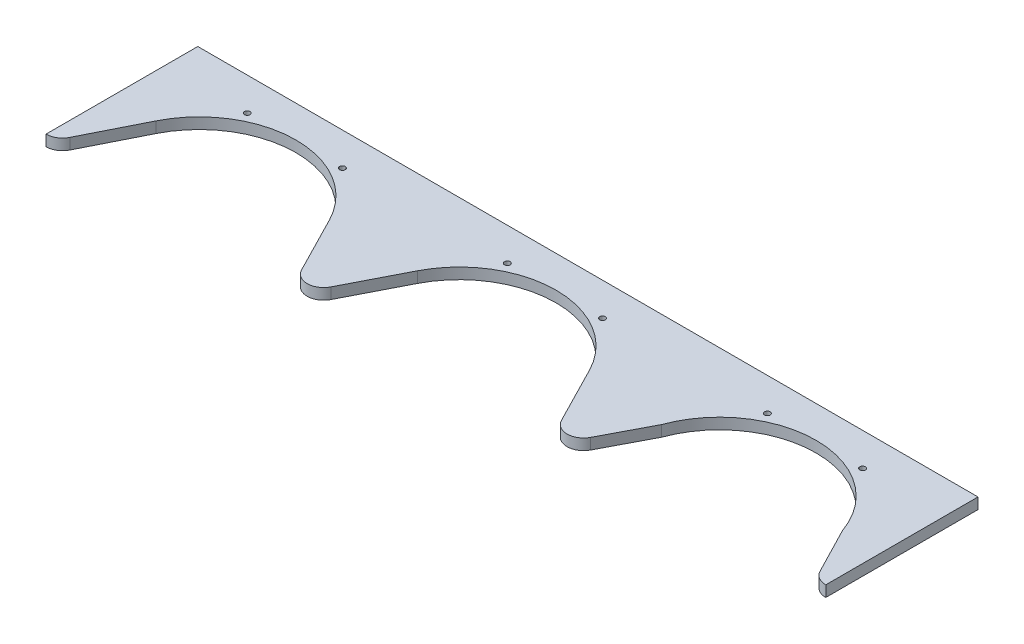
ISO-10303-21;
HEADER;
FILE_DESCRIPTION(('STEP AP214'),'2;1');
FILE_NAME('part.step','',(''),(''),'','','');
FILE_SCHEMA(('AUTOMOTIVE_DESIGN { 1 0 10303 214 1 1 1 1 }'));
ENDSEC;
DATA;
#1=APPLICATION_CONTEXT('core data for automotive mechanical design processes');
#2=APPLICATION_PROTOCOL_DEFINITION('international standard','automotive_design',2000,#1);
#3=PRODUCT_CONTEXT('',#1,'mechanical');
#4=PRODUCT('Part','Part','',(#3));
#5=PRODUCT_RELATED_PRODUCT_CATEGORY('part','',(#4));
#6=PRODUCT_DEFINITION_FORMATION('','',#4);
#7=PRODUCT_DEFINITION_CONTEXT('part definition',#1,'design');
#8=PRODUCT_DEFINITION('design','',#6,#7);
#9=PRODUCT_DEFINITION_SHAPE('','',#8);
#10=(LENGTH_UNIT() NAMED_UNIT(*) SI_UNIT(.MILLI.,.METRE.));
#11=(NAMED_UNIT(*) PLANE_ANGLE_UNIT() SI_UNIT($,.RADIAN.));
#12=(NAMED_UNIT(*) SI_UNIT($,.STERADIAN.) SOLID_ANGLE_UNIT());
#13=UNCERTAINTY_MEASURE_WITH_UNIT(LENGTH_MEASURE(1.E-05),#10,'distance_accuracy_value','');
#14=(GEOMETRIC_REPRESENTATION_CONTEXT(3) GLOBAL_UNCERTAINTY_ASSIGNED_CONTEXT((#13)) GLOBAL_UNIT_ASSIGNED_CONTEXT((#10,
#11,#12)) REPRESENTATION_CONTEXT('',''));
#15=CARTESIAN_POINT('',(0.,0.,0.));
#16=DIRECTION('',(0.,0.,1.));
#17=DIRECTION('',(1.,0.,0.));
#18=AXIS2_PLACEMENT_3D('',#15,#16,#17);
#19=CARTESIAN_POINT('',(-280.073238202378,-6.35,2.62205042113195));
#20=DIRECTION('',(-1.,0.,0.));
#21=DIRECTION('',(0.,0.,1.));
#22=AXIS2_PLACEMENT_3D('',#19,#20,#21);
#23=PLANE('',#22);
#24=DIRECTION('',(0.,0.,1.));
#25=VECTOR('',#24,1.);
#26=CARTESIAN_POINT('',(-280.073238202378,0.,2.62205042113195));
#27=LINE('',#26,#25);
#28=CARTESIAN_POINT('',(-280.073238202378,0.,-62.6015765640897));
#29=VERTEX_POINT('',#28);
#30=CARTESIAN_POINT('',(-280.073238202378,0.,25.1077984359102));
#31=VERTEX_POINT('',#30);
#32=EDGE_CURVE('E225',#29,#31,#27,.T.);
#33=ORIENTED_EDGE('',*,*,#32,.F.);
#34=DIRECTION('',(0.,1.,0.));
#35=VECTOR('',#34,1.);
#36=CARTESIAN_POINT('',(-280.073238202378,-6.35,-62.6015765640897));
#37=LINE('',#36,#35);
#38=CARTESIAN_POINT('',(-280.073238202378,-6.35,-62.6015765640897));
#39=VERTEX_POINT('',#38);
#40=EDGE_CURVE('E171',#39,#29,#37,.T.);
#41=ORIENTED_EDGE('',*,*,#40,.F.);
#42=DIRECTION('',(0.,0.,1.));
#43=VECTOR('',#42,1.);
#44=CARTESIAN_POINT('',(-280.073238202378,-6.35,2.62205042113195));
#45=LINE('',#44,#43);
#46=CARTESIAN_POINT('',(-280.073238202378,-6.35,25.1077984359102));
#47=VERTEX_POINT('',#46);
#48=EDGE_CURVE('E166',#39,#47,#45,.T.);
#49=ORIENTED_EDGE('',*,*,#48,.T.);
#50=DIRECTION('',(0.,1.,0.));
#51=VECTOR('',#50,1.);
#52=CARTESIAN_POINT('',(-280.073238202378,-6.35,25.1077984359102));
#53=LINE('',#52,#51);
#54=EDGE_CURVE('E148',#47,#31,#53,.T.);
#55=ORIENTED_EDGE('',*,*,#54,.T.);
#56=EDGE_LOOP('',(#33,#41,#49,#55));
#57=FACE_BOUND('',#56,.T.);
#58=ADVANCED_FACE('F35',(#57),#23,.T.);
#59=CARTESIAN_POINT('',(-427.444683767428,-6.35,-62.6015765640897));
#60=DIRECTION('',(0.,0.,1.));
#61=DIRECTION('',(1.,0.,0.));
#62=AXIS2_PLACEMENT_3D('',#59,#60,#61);
#63=PLANE('',#62);
#64=DIRECTION('',(1.,0.,0.));
#65=VECTOR('',#64,1.);
#66=CARTESIAN_POINT('',(-427.444683767428,0.,-62.6015765640897));
#67=LINE('',#66,#65);
#68=CARTESIAN_POINT('',(170.776761797622,0.,-62.6015765640897));
#69=VERTEX_POINT('',#68);
#70=EDGE_CURVE('E259',#29,#69,#67,.T.);
#71=ORIENTED_EDGE('',*,*,#70,.T.);
#72=DIRECTION('',(0.,1.,0.));
#73=VECTOR('',#72,1.);
#74=CARTESIAN_POINT('',(170.776761797622,-6.35,-62.6015765640897));
#75=LINE('',#74,#73);
#76=CARTESIAN_POINT('',(170.776761797622,-6.35,-62.6015765640897));
#77=VERTEX_POINT('',#76);
#78=EDGE_CURVE('E276',#77,#69,#75,.T.);
#79=ORIENTED_EDGE('',*,*,#78,.F.);
#80=DIRECTION('',(1.,0.,0.));
#81=VECTOR('',#80,1.);
#82=CARTESIAN_POINT('',(-427.444683767428,-6.35,-62.6015765640897));
#83=LINE('',#82,#81);
#84=EDGE_CURVE('E206',#39,#77,#83,.T.);
#85=ORIENTED_EDGE('',*,*,#84,.F.);
#86=ORIENTED_EDGE('',*,*,#40,.T.);
#87=EDGE_LOOP('',(#71,#79,#85,#86));
#88=FACE_BOUND('',#87,.T.);
#89=ADVANCED_FACE('F328',(#88),#63,.F.);
#90=CARTESIAN_POINT('',(170.776761797622,-6.35,2.62205042113195));
#91=DIRECTION('',(-1.,0.,0.));
#92=DIRECTION('',(0.,0.,1.));
#93=AXIS2_PLACEMENT_3D('',#90,#91,#92);
#94=PLANE('',#93);
#95=DIRECTION('',(0.,0.,1.));
#96=VECTOR('',#95,1.);
#97=CARTESIAN_POINT('',(170.776761797622,0.,2.62205042113195));
#98=LINE('',#97,#96);
#99=CARTESIAN_POINT('',(170.776761797622,0.,25.3727717752158));
#100=VERTEX_POINT('',#99);
#101=EDGE_CURVE('E256',#69,#100,#98,.T.);
#102=ORIENTED_EDGE('',*,*,#101,.T.);
#103=DIRECTION('',(0.,1.,0.));
#104=VECTOR('',#103,1.);
#105=CARTESIAN_POINT('',(170.776761797622,-6.35,25.3727717752158));
#106=LINE('',#105,#104);
#107=CARTESIAN_POINT('',(170.776761797622,-6.35,25.3727717752158));
#108=VERTEX_POINT('',#107);
#109=EDGE_CURVE('E279',#108,#100,#106,.T.);
#110=ORIENTED_EDGE('',*,*,#109,.F.);
#111=DIRECTION('',(0.,0.,1.));
#112=VECTOR('',#111,1.);
#113=CARTESIAN_POINT('',(170.776761797622,-6.35,2.62205042113195));
#114=LINE('',#113,#112);
#115=EDGE_CURVE('E204',#77,#108,#114,.T.);
#116=ORIENTED_EDGE('',*,*,#115,.F.);
#117=ORIENTED_EDGE('',*,*,#78,.T.);
#118=EDGE_LOOP('',(#102,#110,#116,#117));
#119=FACE_BOUND('',#118,.T.);
#120=ADVANCED_FACE('F333',(#119),#94,.F.);
#121=CARTESIAN_POINT('',(170.776761797622,-6.35,15.8477717752158));
#122=DIRECTION('',(0.,1.,0.));
#123=DIRECTION('',(0.,0.,1.));
#124=AXIS2_PLACEMENT_3D('',#121,#122,#123);
#125=CYLINDRICAL_SURFACE('',#124,9.525);
#126=CARTESIAN_POINT('',(170.776761797622,0.,15.8477717752158));
#127=DIRECTION('',(0.,1.,0.));
#128=DIRECTION('',(0.,0.,1.));
#129=AXIS2_PLACEMENT_3D('',#126,#127,#128);
#130=CIRCLE('',#129,9.525);
#131=CARTESIAN_POINT('',(162.31442899308,0.,20.219790588668));
#132=VERTEX_POINT('',#131);
#133=EDGE_CURVE('E253',#132,#100,#130,.T.);
#134=ORIENTED_EDGE('',*,*,#133,.F.);
#135=DIRECTION('',(0.,1.,0.));
#136=VECTOR('',#135,1.);
#137=CARTESIAN_POINT('',(162.31442899308,-6.35,20.219790588668));
#138=LINE('',#137,#136);
#139=CARTESIAN_POINT('',(162.31442899308,-6.35,20.219790588668));
#140=VERTEX_POINT('',#139);
#141=EDGE_CURVE('E281',#140,#132,#138,.T.);
#142=ORIENTED_EDGE('',*,*,#141,.F.);
#143=CARTESIAN_POINT('',(170.776761797622,-6.35,15.8477717752158));
#144=DIRECTION('',(0.,1.,0.));
#145=DIRECTION('',(0.,0.,1.));
#146=AXIS2_PLACEMENT_3D('',#143,#144,#145);
#147=CIRCLE('',#146,9.525);
#148=EDGE_CURVE('E201',#140,#108,#147,.T.);
#149=ORIENTED_EDGE('',*,*,#148,.T.);
#150=ORIENTED_EDGE('',*,*,#109,.T.);
#151=EDGE_LOOP('',(#134,#142,#149,#150));
#152=FACE_BOUND('',#151,.T.);
#153=ADVANCED_FACE('F336',(#152),#125,.T.);
#154=CARTESIAN_POINT('',(30.8846242832339,-6.35,-234.171326043416));
#155=DIRECTION('',(-0.888433890240575,0.,0.459004599837515));
#156=DIRECTION('',(0.459004599837515,0.,0.888433890240576));
#157=AXIS2_PLACEMENT_3D('',#154,#155,#156);
#158=PLANE('',#157);
#159=DIRECTION('',(0.459004599837515,0.,0.888433890240576));
#160=VECTOR('',#159,1.);
#161=CARTESIAN_POINT('',(30.8846242832339,0.,-234.171326043416));
#162=LINE('',#161,#160);
#163=CARTESIAN_POINT('',(148.390090675422,0.,-6.73169108485379));
#164=VERTEX_POINT('',#163);
#165=EDGE_CURVE('E250',#164,#132,#162,.T.);
#166=ORIENTED_EDGE('',*,*,#165,.F.);
#167=DIRECTION('',(0.,1.,0.));
#168=VECTOR('',#167,1.);
#169=CARTESIAN_POINT('',(148.390090675422,-6.35,-6.73169108485379));
#170=LINE('',#169,#168);
#171=CARTESIAN_POINT('',(148.390090675422,-6.35,-6.73169108485379));
#172=VERTEX_POINT('',#171);
#173=EDGE_CURVE('E283',#172,#164,#170,.T.);
#174=ORIENTED_EDGE('',*,*,#173,.F.);
#175=DIRECTION('',(0.459004599837515,0.,0.888433890240576));
#176=VECTOR('',#175,1.);
#177=CARTESIAN_POINT('',(30.8846242832339,-6.35,-234.171326043416));
#178=LINE('',#177,#176);
#179=EDGE_CURVE('E198',#172,#140,#178,.T.);
#180=ORIENTED_EDGE('',*,*,#179,.T.);
#181=ORIENTED_EDGE('',*,*,#141,.T.);
#182=EDGE_LOOP('',(#166,#174,#180,#181));
#183=FACE_BOUND('',#182,.T.);
#184=ADVANCED_FACE('F339',(#183),#158,.T.);
#185=CARTESIAN_POINT('',(95.6350951309553,-6.35,11.6934234359103));
#186=DIRECTION('',(0.,1.,0.));
#187=DIRECTION('',(0.,0.,1.));
#188=AXIS2_PLACEMENT_3D('',#185,#186,#187);
#189=CYLINDRICAL_SURFACE('',#188,55.88);
#190=CARTESIAN_POINT('',(95.6350951309553,0.,11.6934234359103));
#191=DIRECTION('',(0.,1.,0.));
#192=DIRECTION('',(0.,0.,1.));
#193=AXIS2_PLACEMENT_3D('',#190,#191,#192);
#194=CIRCLE('',#193,55.88);
#195=CARTESIAN_POINT('',(43.089138196717,0.,-7.31964601289729));
#196=VERTEX_POINT('',#195);
#197=EDGE_CURVE('E247',#164,#196,#194,.T.);
#198=ORIENTED_EDGE('',*,*,#197,.T.);
#199=DIRECTION('',(0.,1.,0.));
#200=VECTOR('',#199,1.);
#201=CARTESIAN_POINT('',(43.089138196717,-6.35,-7.31964601289729));
#202=LINE('',#201,#200);
#203=CARTESIAN_POINT('',(43.089138196717,-6.35,-7.31964601289729));
#204=VERTEX_POINT('',#203);
#205=EDGE_CURVE('E285',#204,#196,#202,.T.);
#206=ORIENTED_EDGE('',*,*,#205,.F.);
#207=CARTESIAN_POINT('',(95.6350951309553,-6.35,11.6934234359103));
#208=DIRECTION('',(0.,1.,0.));
#209=DIRECTION('',(0.,0.,1.));
#210=AXIS2_PLACEMENT_3D('',#207,#208,#209);
#211=CIRCLE('',#210,55.88);
#212=EDGE_CURVE('E195',#172,#204,#211,.T.);
#213=ORIENTED_EDGE('',*,*,#212,.F.);
#214=ORIENTED_EDGE('',*,*,#173,.T.);
#215=EDGE_LOOP('',(#198,#206,#213,#214));
#216=FACE_BOUND('',#215,.T.);
#217=ADVANCED_FACE('F344',(#216),#189,.F.);
#218=CARTESIAN_POINT('',(-62.2826144303274,-6.35,193.871681693301));
#219=DIRECTION('',(0.885857198551275,0.,0.463957997856364));
#220=DIRECTION('',(0.463957997856364,0.,-0.885857198551275));
#221=AXIS2_PLACEMENT_3D('',#218,#219,#220);
#222=PLANE('',#221);
#223=DIRECTION('',(0.463957997856364,0.,-0.885857198551275));
#224=VECTOR('',#223,1.);
#225=CARTESIAN_POINT('',(-62.2826144303274,0.,193.871681693301));
#226=LINE('',#225,#224);
#227=CARTESIAN_POINT('',(29.0256455147359,0.,19.5324532863222));
#228=VERTEX_POINT('',#227);
#229=EDGE_CURVE('E245',#228,#196,#226,.T.);
#230=ORIENTED_EDGE('',*,*,#229,.F.);
#231=DIRECTION('',(0.,1.,0.));
#232=VECTOR('',#231,1.);
#233=CARTESIAN_POINT('',(29.0256455147359,-6.35,19.5324532863222));
#234=LINE('',#233,#232);
#235=CARTESIAN_POINT('',(29.0256455147359,-6.35,19.5324532863222));
#236=VERTEX_POINT('',#235);
#237=EDGE_CURVE('E305',#228,#236,#234,.F.);
#238=ORIENTED_EDGE('',*,*,#237,.T.);
#239=DIRECTION('',(0.463957997856364,0.,-0.885857198551275));
#240=VECTOR('',#239,1.);
#241=CARTESIAN_POINT('',(-62.2826144303274,-6.35,193.871681693301));
#242=LINE('',#241,#240);
#243=EDGE_CURVE('E193',#236,#204,#242,.T.);
#244=ORIENTED_EDGE('',*,*,#243,.T.);
#245=ORIENTED_EDGE('',*,*,#205,.T.);
#246=EDGE_LOOP('',(#230,#238,#244,#245));
#247=FACE_BOUND('',#246,.T.);
#248=ADVANCED_FACE('F348',(#247),#222,.T.);
#249=CARTESIAN_POINT('',(-86.0632836712445,-6.35,-172.224546601413));
#250=DIRECTION('',(-0.890051077492998,0.,0.455860811491351));
#251=DIRECTION('',(0.455860811491351,0.,0.890051077492998));
#252=AXIS2_PLACEMENT_3D('',#249,#250,#251);
#253=PLANE('',#252);
#254=DIRECTION('',(0.455860811491351,0.,0.890051077492998));
#255=VECTOR('',#254,1.);
#256=CARTESIAN_POINT('',(-86.0632836712445,-6.35,-172.224546601413));
#257=LINE('',#256,#255);
#258=CARTESIAN_POINT('',(-4.9121839920693,-6.35,-13.7800787102265));
#259=VERTEX_POINT('',#258);
#260=CARTESIAN_POINT('',(12.1101191854142,-6.35,19.4553275861955));
#261=VERTEX_POINT('',#260);
#262=EDGE_CURVE('E190',#259,#261,#257,.T.);
#263=ORIENTED_EDGE('',*,*,#262,.T.);
#264=DIRECTION('',(0.,1.,0.));
#265=VECTOR('',#264,1.);
#266=CARTESIAN_POINT('',(12.1101191854142,-6.35,19.4553275861954));
#267=LINE('',#266,#265);
#268=CARTESIAN_POINT('',(12.1101191854142,0.,19.4553275861955));
#269=VERTEX_POINT('',#268);
#270=EDGE_CURVE('E275',#261,#269,#267,.T.);
#271=ORIENTED_EDGE('',*,*,#270,.T.);
#272=DIRECTION('',(0.455860811491351,0.,0.890051077492998));
#273=VECTOR('',#272,1.);
#274=CARTESIAN_POINT('',(-86.0632836712445,0.,-172.224546601413));
#275=LINE('',#274,#273);
#276=CARTESIAN_POINT('',(-4.9121839920693,0.,-13.7800787102265));
#277=VERTEX_POINT('',#276);
#278=EDGE_CURVE('E242',#277,#269,#275,.T.);
#279=ORIENTED_EDGE('',*,*,#278,.F.);
#280=DIRECTION('',(0.,1.,0.));
#281=VECTOR('',#280,1.);
#282=CARTESIAN_POINT('',(-4.9121839920693,-6.35,-13.7800787102265));
#283=LINE('',#282,#281);
#284=EDGE_CURVE('E288',#259,#277,#283,.T.);
#285=ORIENTED_EDGE('',*,*,#284,.F.);
#286=EDGE_LOOP('',(#263,#271,#279,#285));
#287=FACE_BOUND('',#286,.T.);
#288=ADVANCED_FACE('F355',(#287),#253,.T.);
#289=CARTESIAN_POINT('',(-54.6482382023781,-6.35,11.6934234359103));
#290=DIRECTION('',(0.,1.,0.));
#291=DIRECTION('',(0.,0.,1.));
#292=AXIS2_PLACEMENT_3D('',#289,#290,#291);
#293=CYLINDRICAL_SURFACE('',#292,55.88);
#294=CARTESIAN_POINT('',(-54.6482382023781,0.,11.6934234359103));
#295=DIRECTION('',(0.,1.,0.));
#296=DIRECTION('',(0.,0.,1.));
#297=AXIS2_PLACEMENT_3D('',#294,#295,#296);
#298=CIRCLE('',#297,55.88);
#299=CARTESIAN_POINT('',(-104.384292412687,0.,-13.7800787102265));
#300=VERTEX_POINT('',#299);
#301=EDGE_CURVE('E239',#277,#300,#298,.T.);
#302=ORIENTED_EDGE('',*,*,#301,.T.);
#303=DIRECTION('',(0.,1.,0.));
#304=VECTOR('',#303,1.);
#305=CARTESIAN_POINT('',(-104.384292412687,-6.35,-13.7800787102265));
#306=LINE('',#305,#304);
#307=CARTESIAN_POINT('',(-104.384292412687,-6.35,-13.7800787102265));
#308=VERTEX_POINT('',#307);
#309=EDGE_CURVE('E290',#308,#300,#306,.T.);
#310=ORIENTED_EDGE('',*,*,#309,.F.);
#311=CARTESIAN_POINT('',(-54.6482382023781,-6.35,11.6934234359103));
#312=DIRECTION('',(0.,1.,0.));
#313=DIRECTION('',(0.,0.,1.));
#314=AXIS2_PLACEMENT_3D('',#311,#312,#313);
#315=CIRCLE('',#314,55.88);
#316=EDGE_CURVE('E187',#259,#308,#315,.T.);
#317=ORIENTED_EDGE('',*,*,#316,.F.);
#318=ORIENTED_EDGE('',*,*,#284,.T.);
#319=EDGE_LOOP('',(#302,#310,#317,#318));
#320=FACE_BOUND('',#319,.T.);
#321=ADVANCED_FACE('F361',(#320),#293,.F.);
#322=CARTESIAN_POINT('',(-178.174165086371,-6.35,130.291870502565));
#323=DIRECTION('',(0.890051077492997,0.,0.455860811491352));
#324=DIRECTION('',(0.455860811491352,0.,-0.890051077492997));
#325=AXIS2_PLACEMENT_3D('',#322,#323,#324);
#326=PLANE('',#325);
#327=DIRECTION('',(0.455860811491352,0.,-0.890051077492997));
#328=VECTOR('',#327,1.);
#329=CARTESIAN_POINT('',(-178.174165086371,0.,130.291870502565));
#330=LINE('',#329,#328);
#331=CARTESIAN_POINT('',(-121.312168355924,0.,19.2709619652273));
#332=VERTEX_POINT('',#331);
#333=EDGE_CURVE('E237',#332,#300,#330,.T.);
#334=ORIENTED_EDGE('',*,*,#333,.F.);
#335=DIRECTION('',(0.,1.,0.));
#336=VECTOR('',#335,1.);
#337=CARTESIAN_POINT('',(-121.312168355924,-6.35,19.2709619652274));
#338=LINE('',#337,#336);
#339=CARTESIAN_POINT('',(-121.312168355924,-6.35,19.2709619652273));
#340=VERTEX_POINT('',#339);
#341=EDGE_CURVE('E11',#332,#340,#338,.F.);
#342=ORIENTED_EDGE('',*,*,#341,.T.);
#343=DIRECTION('',(0.455860811491352,0.,-0.890051077492997));
#344=VECTOR('',#343,1.);
#345=CARTESIAN_POINT('',(-178.174165086371,-6.35,130.291870502565));
#346=LINE('',#345,#344);
#347=EDGE_CURVE('E185',#340,#308,#346,.T.);
#348=ORIENTED_EDGE('',*,*,#347,.T.);
#349=ORIENTED_EDGE('',*,*,#309,.T.);
#350=EDGE_LOOP('',(#334,#342,#348,#349));
#351=FACE_BOUND('',#350,.T.);
#352=ADVANCED_FACE('F430',(#351),#326,.T.);
#353=CARTESIAN_POINT('',(-205.116375847367,-6.35,-111.248676134711));
#354=DIRECTION('',(-0.890051077492997,0.,0.455860811491352));
#355=DIRECTION('',(0.455860811491352,0.,0.890051077492997));
#356=AXIS2_PLACEMENT_3D('',#353,#354,#355);
#357=PLANE('',#356);
#358=DIRECTION('',(0.455860811491352,0.,0.890051077492997));
#359=VECTOR('',#358,1.);
#360=CARTESIAN_POINT('',(-205.116375847367,-6.35,-111.248676134711));
#361=LINE('',#360,#359);
#362=CARTESIAN_POINT('',(-155.195517325403,-6.35,-13.7800787102264));
#363=VERTEX_POINT('',#362);
#364=CARTESIAN_POINT('',(-138.267641382166,-6.35,19.2709619652274));
#365=VERTEX_POINT('',#364);
#366=EDGE_CURVE('E183',#363,#365,#361,.T.);
#367=ORIENTED_EDGE('',*,*,#366,.T.);
#368=DIRECTION('',(0.,1.,0.));
#369=VECTOR('',#368,1.);
#370=CARTESIAN_POINT('',(-138.267641382166,-6.35,19.2709619652274));
#371=LINE('',#370,#369);
#372=CARTESIAN_POINT('',(-138.267641382166,0.,19.2709619652274));
#373=VERTEX_POINT('',#372);
#374=EDGE_CURVE('E43',#365,#373,#371,.T.);
#375=ORIENTED_EDGE('',*,*,#374,.T.);
#376=DIRECTION('',(0.455860811491352,0.,0.890051077492997));
#377=VECTOR('',#376,1.);
#378=CARTESIAN_POINT('',(-205.116375847367,0.,-111.248676134711));
#379=LINE('',#378,#377);
#380=CARTESIAN_POINT('',(-155.195517325403,0.,-13.7800787102264));
#381=VERTEX_POINT('',#380);
#382=EDGE_CURVE('E234',#381,#373,#379,.T.);
#383=ORIENTED_EDGE('',*,*,#382,.F.);
#384=DIRECTION('',(0.,1.,0.));
#385=VECTOR('',#384,1.);
#386=CARTESIAN_POINT('',(-155.195517325403,-6.35,-13.7800787102264));
#387=LINE('',#386,#385);
#388=EDGE_CURVE('E293',#363,#381,#387,.T.);
#389=ORIENTED_EDGE('',*,*,#388,.F.);
#390=EDGE_LOOP('',(#367,#375,#383,#389));
#391=FACE_BOUND('',#390,.T.);
#392=ADVANCED_FACE('F313',(#391),#357,.T.);
#393=CARTESIAN_POINT('',(-204.931571535711,-6.35,11.6934234359103));
#394=DIRECTION('',(0.,1.,0.));
#395=DIRECTION('',(0.,0.,1.));
#396=AXIS2_PLACEMENT_3D('',#393,#394,#395);
#397=CYLINDRICAL_SURFACE('',#396,55.88);
#398=CARTESIAN_POINT('',(-204.931571535711,0.,11.6934234359103));
#399=DIRECTION('',(0.,1.,0.));
#400=DIRECTION('',(0.,0.,1.));
#401=AXIS2_PLACEMENT_3D('',#398,#399,#400);
#402=CIRCLE('',#401,55.88);
#403=CARTESIAN_POINT('',(-254.86877631085,0.,-13.3834579341069));
#404=VERTEX_POINT('',#403);
#405=EDGE_CURVE('E231',#381,#404,#402,.T.);
#406=ORIENTED_EDGE('',*,*,#405,.T.);
#407=DIRECTION('',(0.,1.,0.));
#408=VECTOR('',#407,1.);
#409=CARTESIAN_POINT('',(-254.86877631085,-6.35,-13.3834579341069));
#410=LINE('',#409,#408);
#411=CARTESIAN_POINT('',(-254.86877631085,-6.35,-13.3834579341069));
#412=VERTEX_POINT('',#411);
#413=EDGE_CURVE('E295',#412,#404,#410,.T.);
#414=ORIENTED_EDGE('',*,*,#413,.F.);
#415=CARTESIAN_POINT('',(-204.931571535711,-6.35,11.6934234359103));
#416=DIRECTION('',(0.,1.,0.));
#417=DIRECTION('',(0.,0.,1.));
#418=AXIS2_PLACEMENT_3D('',#415,#416,#417);
#419=CIRCLE('',#418,55.88);
#420=EDGE_CURVE('E181',#363,#412,#419,.T.);
#421=ORIENTED_EDGE('',*,*,#420,.F.);
#422=ORIENTED_EDGE('',*,*,#388,.T.);
#423=EDGE_LOOP('',(#406,#414,#421,#422));
#424=FACE_BOUND('',#423,.T.);
#425=ADVANCED_FACE('F321',(#424),#397,.F.);
#426=CARTESIAN_POINT('',(-296.042355242531,-6.35,68.6081347244212));
#427=DIRECTION('',(-0.893650765482072,0.,-0.448763088225076));
#428=DIRECTION('',(-0.448763088225076,0.,0.893650765482072));
#429=AXIS2_PLACEMENT_3D('',#426,#427,#428);
#430=PLANE('',#429);
#431=DIRECTION('',(-0.448763088225076,0.,0.893650765482072));
#432=VECTOR('',#431,1.);
#433=CARTESIAN_POINT('',(-296.042355242531,0.,68.6081347244212));
#434=LINE('',#433,#432);
#435=CARTESIAN_POINT('',(-271.561214661161,0.,19.8572668512541));
#436=VERTEX_POINT('',#435);
#437=EDGE_CURVE('E228',#404,#436,#434,.T.);
#438=ORIENTED_EDGE('',*,*,#437,.T.);
#439=DIRECTION('',(0.,1.,0.));
#440=VECTOR('',#439,1.);
#441=CARTESIAN_POINT('',(-271.561214661161,-6.35,19.8572668512541));
#442=LINE('',#441,#440);
#443=CARTESIAN_POINT('',(-271.561214661161,-6.35,19.8572668512541));
#444=VERTEX_POINT('',#443);
#445=EDGE_CURVE('E158',#444,#436,#442,.T.);
#446=ORIENTED_EDGE('',*,*,#445,.F.);
#447=DIRECTION('',(-0.448763088225076,0.,0.893650765482072));
#448=VECTOR('',#447,1.);
#449=CARTESIAN_POINT('',(-296.042355242531,-6.35,68.6081347244212));
#450=LINE('',#449,#448);
#451=EDGE_CURVE('E168',#412,#444,#450,.T.);
#452=ORIENTED_EDGE('',*,*,#451,.F.);
#453=ORIENTED_EDGE('',*,*,#413,.T.);
#454=EDGE_LOOP('',(#438,#446,#452,#453));
#455=FACE_BOUND('',#454,.T.);
#456=ADVANCED_FACE('F324',(#455),#430,.F.);
#457=CARTESIAN_POINT('',(123.143295130955,-6.35,-43.5515765640897));
#458=DIRECTION('',(0.,1.,0.));
#459=DIRECTION('',(0.,0.,1.));
#460=AXIS2_PLACEMENT_3D('',#457,#458,#459);
#461=CYLINDRICAL_SURFACE('',#460,1.63830000000002);
#462=CARTESIAN_POINT('',(123.143295130955,-6.35,-43.5515765640897));
#463=DIRECTION('',(0.,1.,0.));
#464=DIRECTION('',(0.,0.,1.));
#465=AXIS2_PLACEMENT_3D('',#462,#463,#464);
#466=CIRCLE('',#465,1.63830000000002);
#467=CARTESIAN_POINT('',(123.143295130955,-6.35,-41.9132765640897));
#468=VERTEX_POINT('',#467);
#469=EDGE_CURVE('E214',#468,#468,#466,.T.);
#470=ORIENTED_EDGE('',*,*,#469,.F.);
#471=EDGE_LOOP('',(#470));
#472=FACE_BOUND('',#471,.T.);
#473=CARTESIAN_POINT('',(123.143295130955,0.,-43.5515765640897));
#474=DIRECTION('',(0.,1.,0.));
#475=DIRECTION('',(0.,0.,1.));
#476=AXIS2_PLACEMENT_3D('',#473,#474,#475);
#477=CIRCLE('',#476,1.63830000000002);
#478=CARTESIAN_POINT('',(123.143295130955,0.,-41.9132765640897));
#479=VERTEX_POINT('',#478);
#480=EDGE_CURVE('E268',#479,#479,#477,.T.);
#481=ORIENTED_EDGE('',*,*,#480,.T.);
#482=EDGE_LOOP('',(#481));
#483=FACE_BOUND('',#482,.T.);
#484=ADVANCED_FACE('F404',(#472,#483),#461,.F.);
#485=CARTESIAN_POINT('',(-82.1564382023781,-6.35,-43.5515765640897));
#486=DIRECTION('',(0.,1.,0.));
#487=DIRECTION('',(0.,0.,1.));
#488=AXIS2_PLACEMENT_3D('',#485,#486,#487);
#489=CYLINDRICAL_SURFACE('',#488,1.63829999999999);
#490=CARTESIAN_POINT('',(-82.1564382023781,-6.35,-43.5515765640897));
#491=DIRECTION('',(0.,1.,0.));
#492=DIRECTION('',(0.,0.,1.));
#493=AXIS2_PLACEMENT_3D('',#490,#491,#492);
#494=CIRCLE('',#493,1.63829999999999);
#495=CARTESIAN_POINT('',(-82.1564382023781,-6.35,-41.9132765640897));
#496=VERTEX_POINT('',#495);
#497=EDGE_CURVE('E211',#496,#496,#494,.T.);
#498=ORIENTED_EDGE('',*,*,#497,.F.);
#499=EDGE_LOOP('',(#498));
#500=FACE_BOUND('',#499,.T.);
#501=CARTESIAN_POINT('',(-82.1564382023781,0.,-43.5515765640897));
#502=DIRECTION('',(0.,1.,0.));
#503=DIRECTION('',(0.,0.,1.));
#504=AXIS2_PLACEMENT_3D('',#501,#502,#503);
#505=CIRCLE('',#504,1.63829999999999);
#506=CARTESIAN_POINT('',(-82.1564382023781,0.,-41.9132765640897));
#507=VERTEX_POINT('',#506);
#508=EDGE_CURVE('E265',#507,#507,#505,.T.);
#509=ORIENTED_EDGE('',*,*,#508,.T.);
#510=EDGE_LOOP('',(#509));
#511=FACE_BOUND('',#510,.T.);
#512=ADVANCED_FACE('F407',(#500,#511),#489,.F.);
#513=CARTESIAN_POINT('',(-27.1400382023781,-6.35,-43.5515765640897));
#514=DIRECTION('',(0.,1.,0.));
#515=DIRECTION('',(0.,0.,1.));
#516=AXIS2_PLACEMENT_3D('',#513,#514,#515);
#517=CYLINDRICAL_SURFACE('',#516,1.63829999999999);
#518=CARTESIAN_POINT('',(-27.1400382023781,-6.35,-43.5515765640897));
#519=DIRECTION('',(0.,1.,0.));
#520=DIRECTION('',(0.,0.,1.));
#521=AXIS2_PLACEMENT_3D('',#518,#519,#520);
#522=CIRCLE('',#521,1.63829999999999);
#523=CARTESIAN_POINT('',(-27.1400382023781,-6.35,-41.9132765640897));
#524=VERTEX_POINT('',#523);
#525=EDGE_CURVE('E208',#524,#524,#522,.T.);
#526=ORIENTED_EDGE('',*,*,#525,.F.);
#527=EDGE_LOOP('',(#526));
#528=FACE_BOUND('',#527,.T.);
#529=CARTESIAN_POINT('',(-27.1400382023781,0.,-43.5515765640897));
#530=DIRECTION('',(0.,1.,0.));
#531=DIRECTION('',(0.,0.,1.));
#532=AXIS2_PLACEMENT_3D('',#529,#530,#531);
#533=CIRCLE('',#532,1.63829999999999);
#534=CARTESIAN_POINT('',(-27.1400382023781,0.,-41.9132765640897));
#535=VERTEX_POINT('',#534);
#536=EDGE_CURVE('E262',#535,#535,#533,.T.);
#537=ORIENTED_EDGE('',*,*,#536,.T.);
#538=EDGE_LOOP('',(#537));
#539=FACE_BOUND('',#538,.T.);
#540=ADVANCED_FACE('F411',(#528,#539),#517,.F.);
#541=CARTESIAN_POINT('',(-280.073238202378,-6.35,15.5827984359102));
#542=DIRECTION('',(0.,1.,0.));
#543=DIRECTION('',(0.,0.,1.));
#544=AXIS2_PLACEMENT_3D('',#541,#542,#543);
#545=CYLINDRICAL_SURFACE('',#544,9.52500000000002);
#546=CARTESIAN_POINT('',(-280.073238202378,0.,15.5827984359102));
#547=DIRECTION('',(0.,1.,0.));
#548=DIRECTION('',(0.,0.,1.));
#549=AXIS2_PLACEMENT_3D('',#546,#547,#548);
#550=CIRCLE('',#549,9.52500000000002);
#551=EDGE_CURVE('E153',#31,#436,#550,.T.);
#552=ORIENTED_EDGE('',*,*,#551,.F.);
#553=ORIENTED_EDGE('',*,*,#54,.F.);
#554=CARTESIAN_POINT('',(-280.073238202378,-6.35,15.5827984359102));
#555=DIRECTION('',(0.,1.,0.));
#556=DIRECTION('',(0.,0.,1.));
#557=AXIS2_PLACEMENT_3D('',#554,#555,#556);
#558=CIRCLE('',#557,9.52500000000002);
#559=EDGE_CURVE('E151',#47,#444,#558,.T.);
#560=ORIENTED_EDGE('',*,*,#559,.T.);
#561=ORIENTED_EDGE('',*,*,#445,.T.);
#562=EDGE_LOOP('',(#552,#553,#560,#561));
#563=FACE_BOUND('',#562,.T.);
#564=ADVANCED_FACE('F150',(#563),#545,.T.);
#565=CARTESIAN_POINT('',(-232.439771535711,-6.35,-43.5515765640897));
#566=DIRECTION('',(0.,1.,0.));
#567=DIRECTION('',(0.,0.,1.));
#568=AXIS2_PLACEMENT_3D('',#565,#566,#567);
#569=CYLINDRICAL_SURFACE('',#568,1.63830000000002);
#570=CARTESIAN_POINT('',(-232.439771535711,-6.35,-43.5515765640897));
#571=DIRECTION('',(0.,1.,0.));
#572=DIRECTION('',(0.,0.,1.));
#573=AXIS2_PLACEMENT_3D('',#570,#571,#572);
#574=CIRCLE('',#573,1.63830000000002);
#575=CARTESIAN_POINT('',(-232.439771535711,-6.35,-41.9132765640897));
#576=VERTEX_POINT('',#575);
#577=EDGE_CURVE('E173',#576,#576,#574,.T.);
#578=ORIENTED_EDGE('',*,*,#577,.F.);
#579=EDGE_LOOP('',(#578));
#580=FACE_BOUND('',#579,.T.);
#581=CARTESIAN_POINT('',(-232.439771535711,0.,-43.5515765640897));
#582=DIRECTION('',(0.,1.,0.));
#583=DIRECTION('',(0.,0.,1.));
#584=AXIS2_PLACEMENT_3D('',#581,#582,#583);
#585=CIRCLE('',#584,1.63830000000002);
#586=CARTESIAN_POINT('',(-232.439771535711,0.,-41.9132765640897));
#587=VERTEX_POINT('',#586);
#588=EDGE_CURVE('E222',#587,#587,#585,.T.);
#589=ORIENTED_EDGE('',*,*,#588,.T.);
#590=EDGE_LOOP('',(#589));
#591=FACE_BOUND('',#590,.T.);
#592=ADVANCED_FACE('F375',(#580,#591),#569,.F.);
#593=CARTESIAN_POINT('',(-177.423371535711,-6.35,-43.5515765640897));
#594=DIRECTION('',(0.,1.,0.));
#595=DIRECTION('',(0.,0.,1.));
#596=AXIS2_PLACEMENT_3D('',#593,#594,#595);
#597=CYLINDRICAL_SURFACE('',#596,1.63830000000002);
#598=CARTESIAN_POINT('',(-177.423371535711,-6.35,-43.5515765640897));
#599=DIRECTION('',(0.,1.,0.));
#600=DIRECTION('',(0.,0.,1.));
#601=AXIS2_PLACEMENT_3D('',#598,#599,#600);
#602=CIRCLE('',#601,1.63830000000002);
#603=CARTESIAN_POINT('',(-177.423371535711,-6.35,-41.9132765640897));
#604=VERTEX_POINT('',#603);
#605=EDGE_CURVE('E176',#604,#604,#602,.T.);
#606=ORIENTED_EDGE('',*,*,#605,.F.);
#607=EDGE_LOOP('',(#606));
#608=FACE_BOUND('',#607,.T.);
#609=CARTESIAN_POINT('',(-177.423371535711,0.,-43.5515765640897));
#610=DIRECTION('',(0.,1.,0.));
#611=DIRECTION('',(0.,0.,1.));
#612=AXIS2_PLACEMENT_3D('',#609,#610,#611);
#613=CIRCLE('',#612,1.63830000000002);
#614=CARTESIAN_POINT('',(-177.423371535711,0.,-41.9132765640897));
#615=VERTEX_POINT('',#614);
#616=EDGE_CURVE('E219',#615,#615,#613,.T.);
#617=ORIENTED_EDGE('',*,*,#616,.T.);
#618=EDGE_LOOP('',(#617));
#619=FACE_BOUND('',#618,.T.);
#620=ADVANCED_FACE('F378',(#608,#619),#597,.F.);
#621=CARTESIAN_POINT('',(68.1268951309552,-6.35,-43.5515765640897));
#622=DIRECTION('',(0.,1.,0.));
#623=DIRECTION('',(0.,0.,1.));
#624=AXIS2_PLACEMENT_3D('',#621,#622,#623);
#625=CYLINDRICAL_SURFACE('',#624,1.63829999999999);
#626=CARTESIAN_POINT('',(68.1268951309552,-6.35,-43.5515765640897));
#627=DIRECTION('',(0.,1.,0.));
#628=DIRECTION('',(0.,0.,1.));
#629=AXIS2_PLACEMENT_3D('',#626,#627,#628);
#630=CIRCLE('',#629,1.63829999999999);
#631=CARTESIAN_POINT('',(68.1268951309552,-6.35,-41.9132765640897));
#632=VERTEX_POINT('',#631);
#633=EDGE_CURVE('E159',#632,#632,#630,.T.);
#634=ORIENTED_EDGE('',*,*,#633,.F.);
#635=EDGE_LOOP('',(#634));
#636=FACE_BOUND('',#635,.T.);
#637=CARTESIAN_POINT('',(68.1268951309552,0.,-43.5515765640897));
#638=DIRECTION('',(0.,1.,0.));
#639=DIRECTION('',(0.,0.,1.));
#640=AXIS2_PLACEMENT_3D('',#637,#638,#639);
#641=CIRCLE('',#640,1.63829999999999);
#642=CARTESIAN_POINT('',(68.1268951309552,0.,-41.9132765640897));
#643=VERTEX_POINT('',#642);
#644=EDGE_CURVE('E271',#643,#643,#641,.T.);
#645=ORIENTED_EDGE('',*,*,#644,.T.);
#646=EDGE_LOOP('',(#645));
#647=FACE_BOUND('',#646,.T.);
#648=ADVANCED_FACE('F381',(#636,#647),#625,.F.);
#649=CARTESIAN_POINT('',(-427.444683767428,-6.35,2.62205042113195));
#650=DIRECTION('',(0.,1.,0.));
#651=DIRECTION('',(0.,0.,1.));
#652=AXIS2_PLACEMENT_3D('',#649,#650,#651);
#653=PLANE('',#652);
#654=ORIENTED_EDGE('',*,*,#605,.T.);
#655=EDGE_LOOP('',(#654));
#656=FACE_BOUND('',#655,.T.);
#657=ORIENTED_EDGE('',*,*,#577,.T.);
#658=EDGE_LOOP('',(#657));
#659=FACE_BOUND('',#658,.T.);
#660=ORIENTED_EDGE('',*,*,#243,.F.);
#661=CARTESIAN_POINT('',(20.587855698535,-6.35,15.1132533567403));
#662=DIRECTION('',(0.,1.,0.));
#663=DIRECTION('',(0.,0.,1.));
#664=AXIS2_PLACEMENT_3D('',#661,#662,#663);
#665=CIRCLE('',#664,9.525);
#666=EDGE_CURVE('E308',#236,#261,#665,.F.);
#667=ORIENTED_EDGE('',*,*,#666,.T.);
#668=ORIENTED_EDGE('',*,*,#262,.F.);
#669=ORIENTED_EDGE('',*,*,#316,.T.);
#670=ORIENTED_EDGE('',*,*,#347,.F.);
#671=CARTESIAN_POINT('',(-129.789904869045,-6.35,14.9288877357722));
#672=DIRECTION('',(0.,1.,0.));
#673=DIRECTION('',(0.,0.,1.));
#674=AXIS2_PLACEMENT_3D('',#671,#672,#673);
#675=CIRCLE('',#674,9.525);
#676=EDGE_CURVE('E50',#340,#365,#675,.F.);
#677=ORIENTED_EDGE('',*,*,#676,.T.);
#678=ORIENTED_EDGE('',*,*,#366,.F.);
#679=ORIENTED_EDGE('',*,*,#420,.T.);
#680=ORIENTED_EDGE('',*,*,#451,.T.);
#681=ORIENTED_EDGE('',*,*,#559,.F.);
#682=ORIENTED_EDGE('',*,*,#48,.F.);
#683=ORIENTED_EDGE('',*,*,#84,.T.);
#684=ORIENTED_EDGE('',*,*,#115,.T.);
#685=ORIENTED_EDGE('',*,*,#148,.F.);
#686=ORIENTED_EDGE('',*,*,#179,.F.);
#687=ORIENTED_EDGE('',*,*,#212,.T.);
#688=EDGE_LOOP('',(#660,#667,#668,#669,#670,#677,#678,#679,#680,#681,#682,#683,#684,#685,#686,#687));
#689=FACE_BOUND('',#688,.T.);
#690=ORIENTED_EDGE('',*,*,#525,.T.);
#691=EDGE_LOOP('',(#690));
#692=FACE_BOUND('',#691,.T.);
#693=ORIENTED_EDGE('',*,*,#497,.T.);
#694=EDGE_LOOP('',(#693));
#695=FACE_BOUND('',#694,.T.);
#696=ORIENTED_EDGE('',*,*,#469,.T.);
#697=EDGE_LOOP('',(#696));
#698=FACE_BOUND('',#697,.T.);
#699=ORIENTED_EDGE('',*,*,#633,.T.);
#700=EDGE_LOOP('',(#699));
#701=FACE_BOUND('',#700,.T.);
#702=ADVANCED_FACE('F163',(#656,#659,#689,#692,#695,#698,#701),#653,.F.);
#703=CARTESIAN_POINT('',(-427.444683767428,0.,2.62205042113195));
#704=DIRECTION('',(0.,1.,0.));
#705=DIRECTION('',(0.,0.,1.));
#706=AXIS2_PLACEMENT_3D('',#703,#704,#705);
#707=PLANE('',#706);
#708=ORIENTED_EDGE('',*,*,#616,.F.);
#709=EDGE_LOOP('',(#708));
#710=FACE_BOUND('',#709,.T.);
#711=ORIENTED_EDGE('',*,*,#588,.F.);
#712=EDGE_LOOP('',(#711));
#713=FACE_BOUND('',#712,.T.);
#714=ORIENTED_EDGE('',*,*,#278,.T.);
#715=CARTESIAN_POINT('',(20.587855698535,0.,15.1132533567403));
#716=DIRECTION('',(0.,1.,0.));
#717=DIRECTION('',(0.,0.,1.));
#718=AXIS2_PLACEMENT_3D('',#715,#716,#717);
#719=CIRCLE('',#718,9.525);
#720=EDGE_CURVE('E303',#269,#228,#719,.T.);
#721=ORIENTED_EDGE('',*,*,#720,.T.);
#722=ORIENTED_EDGE('',*,*,#229,.T.);
#723=ORIENTED_EDGE('',*,*,#197,.F.);
#724=ORIENTED_EDGE('',*,*,#165,.T.);
#725=ORIENTED_EDGE('',*,*,#133,.T.);
#726=ORIENTED_EDGE('',*,*,#101,.F.);
#727=ORIENTED_EDGE('',*,*,#70,.F.);
#728=ORIENTED_EDGE('',*,*,#32,.T.);
#729=ORIENTED_EDGE('',*,*,#551,.T.);
#730=ORIENTED_EDGE('',*,*,#437,.F.);
#731=ORIENTED_EDGE('',*,*,#405,.F.);
#732=ORIENTED_EDGE('',*,*,#382,.T.);
#733=CARTESIAN_POINT('',(-129.789904869045,0.,14.9288877357722));
#734=DIRECTION('',(0.,1.,0.));
#735=DIRECTION('',(0.,0.,1.));
#736=AXIS2_PLACEMENT_3D('',#733,#734,#735);
#737=CIRCLE('',#736,9.525);
#738=EDGE_CURVE('E301',#373,#332,#737,.T.);
#739=ORIENTED_EDGE('',*,*,#738,.T.);
#740=ORIENTED_EDGE('',*,*,#333,.T.);
#741=ORIENTED_EDGE('',*,*,#301,.F.);
#742=EDGE_LOOP('',(#714,#721,#722,#723,#724,#725,#726,#727,#728,#729,#730,#731,#732,#739,#740,#741));
#743=FACE_BOUND('',#742,.T.);
#744=ORIENTED_EDGE('',*,*,#536,.F.);
#745=EDGE_LOOP('',(#744));
#746=FACE_BOUND('',#745,.T.);
#747=ORIENTED_EDGE('',*,*,#508,.F.);
#748=EDGE_LOOP('',(#747));
#749=FACE_BOUND('',#748,.T.);
#750=ORIENTED_EDGE('',*,*,#480,.F.);
#751=EDGE_LOOP('',(#750));
#752=FACE_BOUND('',#751,.T.);
#753=ORIENTED_EDGE('',*,*,#644,.F.);
#754=EDGE_LOOP('',(#753));
#755=FACE_BOUND('',#754,.T.);
#756=ADVANCED_FACE('F317',(#710,#713,#743,#746,#749,#752,#755),#707,.T.);
#757=CARTESIAN_POINT('',(20.587855698535,-6.35,15.1132533567403));
#758=DIRECTION('',(0.,1.,0.));
#759=DIRECTION('',(0.,0.,1.));
#760=AXIS2_PLACEMENT_3D('',#757,#758,#759);
#761=CYLINDRICAL_SURFACE('',#760,9.525);
#762=ORIENTED_EDGE('',*,*,#666,.F.);
#763=ORIENTED_EDGE('',*,*,#237,.F.);
#764=ORIENTED_EDGE('',*,*,#720,.F.);
#765=ORIENTED_EDGE('',*,*,#270,.F.);
#766=EDGE_LOOP('',(#762,#763,#764,#765));
#767=FACE_BOUND('',#766,.T.);
#768=ADVANCED_FACE('F351',(#767),#761,.T.);
#769=CARTESIAN_POINT('',(-129.789904869045,-6.35,14.9288877357722));
#770=DIRECTION('',(0.,1.,0.));
#771=DIRECTION('',(0.,0.,1.));
#772=AXIS2_PLACEMENT_3D('',#769,#770,#771);
#773=CYLINDRICAL_SURFACE('',#772,9.525);
#774=ORIENTED_EDGE('',*,*,#676,.F.);
#775=ORIENTED_EDGE('',*,*,#341,.F.);
#776=ORIENTED_EDGE('',*,*,#738,.F.);
#777=ORIENTED_EDGE('',*,*,#374,.F.);
#778=EDGE_LOOP('',(#774,#775,#776,#777));
#779=FACE_BOUND('',#778,.T.);
#780=ADVANCED_FACE('F37',(#779),#773,.T.);
#781=CLOSED_SHELL('',(#58,#89,#120,#153,#184,#217,#248,#288,#321,#352,#392,#425,#456,#484,#512,
#540,#564,#592,#620,#648,#702,#756,#768,#780));
#782=MANIFOLD_SOLID_BREP('B2',#781);
#783=ADVANCED_BREP_SHAPE_REPRESENTATION('',(#18,#782),#14);
#784=SHAPE_DEFINITION_REPRESENTATION(#9,#783);
ENDSEC;
END-ISO-10303-21;
